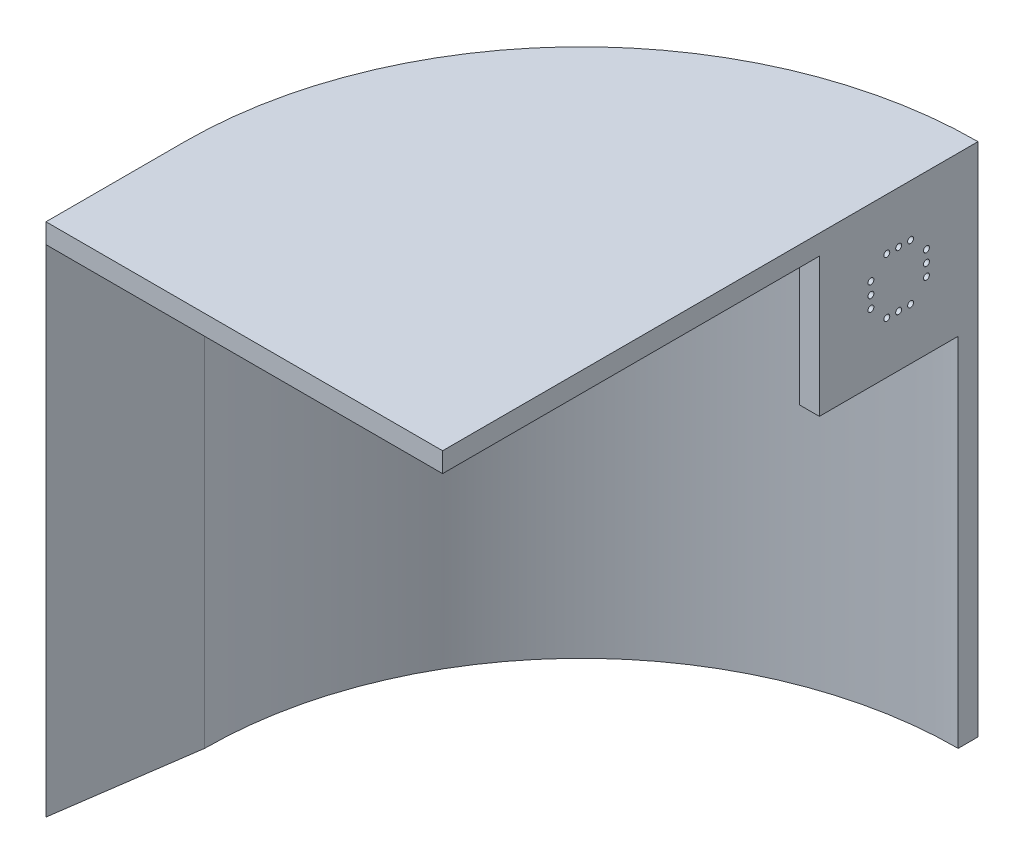
ISO-10303-21;
HEADER;
FILE_DESCRIPTION(('STEP AP214'),'2;1');
FILE_NAME('part.step','',(''),(''),'','','');
FILE_SCHEMA(('AUTOMOTIVE_DESIGN { 1 0 10303 214 1 1 1 1 }'));
ENDSEC;
DATA;
#1=APPLICATION_CONTEXT('core data for automotive mechanical design processes');
#2=APPLICATION_PROTOCOL_DEFINITION('international standard','automotive_design',2000,#1);
#3=PRODUCT_CONTEXT('',#1,'mechanical');
#4=PRODUCT('Part','Part','',(#3));
#5=PRODUCT_RELATED_PRODUCT_CATEGORY('part','',(#4));
#6=PRODUCT_DEFINITION_FORMATION('','',#4);
#7=PRODUCT_DEFINITION_CONTEXT('part definition',#1,'design');
#8=PRODUCT_DEFINITION('design','',#6,#7);
#9=PRODUCT_DEFINITION_SHAPE('','',#8);
#10=(LENGTH_UNIT() NAMED_UNIT(*) SI_UNIT(.MILLI.,.METRE.));
#11=(NAMED_UNIT(*) PLANE_ANGLE_UNIT() SI_UNIT($,.RADIAN.));
#12=(NAMED_UNIT(*) SI_UNIT($,.STERADIAN.) SOLID_ANGLE_UNIT());
#13=UNCERTAINTY_MEASURE_WITH_UNIT(LENGTH_MEASURE(1.E-05),#10,'distance_accuracy_value','');
#14=(GEOMETRIC_REPRESENTATION_CONTEXT(3) GLOBAL_UNCERTAINTY_ASSIGNED_CONTEXT((#13)) GLOBAL_UNIT_ASSIGNED_CONTEXT((#10,
#11,#12)) REPRESENTATION_CONTEXT('',''));
#15=CARTESIAN_POINT('',(0.,0.,0.));
#16=DIRECTION('',(0.,0.,1.));
#17=DIRECTION('',(1.,0.,0.));
#18=AXIS2_PLACEMENT_3D('',#15,#16,#17);
#19=CARTESIAN_POINT('',(0.,130.,35.));
#20=DIRECTION('',(0.,0.,-1.));
#21=DIRECTION('',(1.,0.,0.));
#22=AXIS2_PLACEMENT_3D('',#19,#20,#21);
#23=PLANE('',#22);
#24=DIRECTION('',(1.,0.,0.));
#25=VECTOR('',#24,1.);
#26=CARTESIAN_POINT('',(0.,125.,35.));
#27=LINE('',#26,#25);
#28=CARTESIAN_POINT('',(-100.,125.,35.));
#29=VERTEX_POINT('',#28);
#30=CARTESIAN_POINT('',(0.,125.,35.));
#31=VERTEX_POINT('',#30);
#32=EDGE_CURVE('E139',#29,#31,#27,.T.);
#33=ORIENTED_EDGE('',*,*,#32,.T.);
#34=DIRECTION('',(0.,-1.,0.));
#35=VECTOR('',#34,1.);
#36=CARTESIAN_POINT('',(0.,130.,35.));
#37=LINE('',#36,#35);
#38=CARTESIAN_POINT('',(0.,130.,35.));
#39=VERTEX_POINT('',#38);
#40=EDGE_CURVE('E180',#39,#31,#37,.T.);
#41=ORIENTED_EDGE('',*,*,#40,.F.);
#42=DIRECTION('',(-1.,0.,0.));
#43=VECTOR('',#42,1.);
#44=CARTESIAN_POINT('',(0.,130.,35.));
#45=LINE('',#44,#43);
#46=CARTESIAN_POINT('',(-100.,130.,35.));
#47=VERTEX_POINT('',#46);
#48=EDGE_CURVE('E163',#39,#47,#45,.T.);
#49=ORIENTED_EDGE('',*,*,#48,.T.);
#50=DIRECTION('',(0.,-1.,0.));
#51=VECTOR('',#50,1.);
#52=CARTESIAN_POINT('',(-100.,130.,35.));
#53=LINE('',#52,#51);
#54=EDGE_CURVE('E177',#47,#29,#53,.T.);
#55=ORIENTED_EDGE('',*,*,#54,.T.);
#56=EDGE_LOOP('',(#33,#41,#49,#55));
#57=FACE_BOUND('',#56,.T.);
#58=ADVANCED_FACE('F37',(#57),#23,.F.);
#59=CARTESIAN_POINT('',(0.,130.,0.));
#60=DIRECTION('',(0.,-1.,0.));
#61=DIRECTION('',(0.,0.,1.));
#62=AXIS2_PLACEMENT_3D('',#59,#60,#61);
#63=CYLINDRICAL_SURFACE('',#62,100.);
#64=CARTESIAN_POINT('',(0.,0.,0.));
#65=DIRECTION('',(0.,-1.,0.));
#66=DIRECTION('',(0.,0.,-1.));
#67=AXIS2_PLACEMENT_3D('',#64,#65,#66);
#68=CIRCLE('',#67,100.);
#69=CARTESIAN_POINT('',(-100.,0.,0.));
#70=VERTEX_POINT('',#69);
#71=CARTESIAN_POINT('',(0.,0.,-100.));
#72=VERTEX_POINT('',#71);
#73=EDGE_CURVE('E152',#70,#72,#68,.T.);
#74=ORIENTED_EDGE('',*,*,#73,.F.);
#75=DIRECTION('',(0.,-1.,0.));
#76=VECTOR('',#75,1.);
#77=CARTESIAN_POINT('',(-100.,130.,0.));
#78=LINE('',#77,#76);
#79=CARTESIAN_POINT('',(-100.,130.,0.));
#80=VERTEX_POINT('',#79);
#81=EDGE_CURVE('E168',#80,#70,#78,.T.);
#82=ORIENTED_EDGE('',*,*,#81,.F.);
#83=CARTESIAN_POINT('',(0.,130.,0.));
#84=DIRECTION('',(0.,-1.,0.));
#85=DIRECTION('',(0.,0.,-1.));
#86=AXIS2_PLACEMENT_3D('',#83,#84,#85);
#87=CIRCLE('',#86,100.);
#88=CARTESIAN_POINT('',(0.,130.,-100.));
#89=VERTEX_POINT('',#88);
#90=EDGE_CURVE('E157',#80,#89,#87,.T.);
#91=ORIENTED_EDGE('',*,*,#90,.T.);
#92=DIRECTION('',(0.,-1.,0.));
#93=VECTOR('',#92,1.);
#94=CARTESIAN_POINT('',(0.,130.,-100.));
#95=LINE('',#94,#93);
#96=EDGE_CURVE('E45',#89,#72,#95,.T.);
#97=ORIENTED_EDGE('',*,*,#96,.T.);
#98=EDGE_LOOP('',(#74,#82,#91,#97));
#99=FACE_BOUND('',#98,.T.);
#100=ADVANCED_FACE('F39',(#99),#63,.T.);
#101=CARTESIAN_POINT('',(0.,130.,-100.));
#102=DIRECTION('',(-1.,0.,0.));
#103=DIRECTION('',(0.,0.,-1.));
#104=AXIS2_PLACEMENT_3D('',#101,#102,#103);
#105=PLANE('',#104);
#106=CARTESIAN_POINT('',(0.,103.,-82.9999999999995));
#107=DIRECTION('',(-1.,0.,0.));
#108=DIRECTION('',(0.,0.,1.));
#109=AXIS2_PLACEMENT_3D('',#106,#107,#108);
#110=CIRCLE('',#109,0.749999999999995);
#111=CARTESIAN_POINT('',(0.,103.,-82.2499999999995));
#112=VERTEX_POINT('',#111);
#113=EDGE_CURVE('E221',#112,#112,#110,.T.);
#114=ORIENTED_EDGE('',*,*,#113,.T.);
#115=EDGE_LOOP('',(#114));
#116=FACE_BOUND('',#115,.T.);
#117=CARTESIAN_POINT('',(0.,103.,-76.9999999999995));
#118=DIRECTION('',(-1.,0.,0.));
#119=DIRECTION('',(0.,0.,1.));
#120=AXIS2_PLACEMENT_3D('',#117,#118,#119);
#121=CIRCLE('',#120,0.749999999999995);
#122=CARTESIAN_POINT('',(0.,103.,-76.2499999999995));
#123=VERTEX_POINT('',#122);
#124=EDGE_CURVE('E220',#123,#123,#121,.T.);
#125=ORIENTED_EDGE('',*,*,#124,.T.);
#126=EDGE_LOOP('',(#125));
#127=FACE_BOUND('',#126,.T.);
#128=CARTESIAN_POINT('',(0.,103.,-79.9999999999995));
#129=DIRECTION('',(-1.,0.,0.));
#130=DIRECTION('',(0.,0.,1.));
#131=AXIS2_PLACEMENT_3D('',#128,#129,#130);
#132=CIRCLE('',#131,0.749999999999995);
#133=CARTESIAN_POINT('',(0.,103.,-79.2499999999995));
#134=VERTEX_POINT('',#133);
#135=EDGE_CURVE('E227',#134,#134,#132,.T.);
#136=ORIENTED_EDGE('',*,*,#135,.T.);
#137=EDGE_LOOP('',(#136));
#138=FACE_BOUND('',#137,.T.);
#139=CARTESIAN_POINT('',(0.,117.000000000001,-77.0000000000002));
#140=DIRECTION('',(-1.,0.,0.));
#141=DIRECTION('',(0.,0.,1.));
#142=AXIS2_PLACEMENT_3D('',#139,#140,#141);
#143=CIRCLE('',#142,0.749999999999999);
#144=CARTESIAN_POINT('',(0.,117.000000000001,-76.2500000000002));
#145=VERTEX_POINT('',#144);
#146=EDGE_CURVE('E239',#145,#145,#143,.T.);
#147=ORIENTED_EDGE('',*,*,#146,.T.);
#148=EDGE_LOOP('',(#147));
#149=FACE_BOUND('',#148,.T.);
#150=CARTESIAN_POINT('',(0.,110.000000000001,-72.9999999999997));
#151=DIRECTION('',(-1.,0.,0.));
#152=DIRECTION('',(0.,0.,1.));
#153=AXIS2_PLACEMENT_3D('',#150,#151,#152);
#154=CIRCLE('',#153,0.749999999999995);
#155=CARTESIAN_POINT('',(0.,110.000000000001,-72.2499999999997));
#156=VERTEX_POINT('',#155);
#157=EDGE_CURVE('E240',#156,#156,#154,.T.);
#158=ORIENTED_EDGE('',*,*,#157,.T.);
#159=EDGE_LOOP('',(#158));
#160=FACE_BOUND('',#159,.T.);
#161=CARTESIAN_POINT('',(0.,113.000000000001,-72.9999999999997));
#162=DIRECTION('',(-1.,0.,0.));
#163=DIRECTION('',(0.,0.,1.));
#164=AXIS2_PLACEMENT_3D('',#161,#162,#163);
#165=CIRCLE('',#164,0.749999999999995);
#166=CARTESIAN_POINT('',(0.,113.000000000001,-72.2499999999997));
#167=VERTEX_POINT('',#166);
#168=EDGE_CURVE('E253',#167,#167,#165,.T.);
#169=ORIENTED_EDGE('',*,*,#168,.T.);
#170=EDGE_LOOP('',(#169));
#171=FACE_BOUND('',#170,.T.);
#172=CARTESIAN_POINT('',(0.,107.000000000001,-72.9999999999997));
#173=DIRECTION('',(-1.,0.,0.));
#174=DIRECTION('',(0.,0.,1.));
#175=AXIS2_PLACEMENT_3D('',#172,#173,#174);
#176=CIRCLE('',#175,0.749999999999995);
#177=CARTESIAN_POINT('',(0.,107.000000000001,-72.2499999999997));
#178=VERTEX_POINT('',#177);
#179=EDGE_CURVE('E233',#178,#178,#176,.T.);
#180=ORIENTED_EDGE('',*,*,#179,.T.);
#181=EDGE_LOOP('',(#180));
#182=FACE_BOUND('',#181,.T.);
#183=CARTESIAN_POINT('',(0.,117.000000000001,-83.0000000000002));
#184=DIRECTION('',(-1.,0.,0.));
#185=DIRECTION('',(0.,0.,1.));
#186=AXIS2_PLACEMENT_3D('',#183,#184,#185);
#187=CIRCLE('',#186,0.749999999999999);
#188=CARTESIAN_POINT('',(0.,117.000000000001,-82.2500000000002));
#189=VERTEX_POINT('',#188);
#190=EDGE_CURVE('E247',#189,#189,#187,.T.);
#191=ORIENTED_EDGE('',*,*,#190,.T.);
#192=EDGE_LOOP('',(#191));
#193=FACE_BOUND('',#192,.T.);
#194=CARTESIAN_POINT('',(0.,117.000000000001,-80.0000000000002));
#195=DIRECTION('',(-1.,0.,0.));
#196=DIRECTION('',(0.,0.,1.));
#197=AXIS2_PLACEMENT_3D('',#194,#195,#196);
#198=CIRCLE('',#197,0.749999999999999);
#199=CARTESIAN_POINT('',(0.,117.000000000001,-79.2500000000002));
#200=VERTEX_POINT('',#199);
#201=EDGE_CURVE('E263',#200,#200,#198,.T.);
#202=ORIENTED_EDGE('',*,*,#201,.T.);
#203=EDGE_LOOP('',(#202));
#204=FACE_BOUND('',#203,.T.);
#205=CARTESIAN_POINT('',(0.,113.,-87.));
#206=DIRECTION('',(-1.,0.,0.));
#207=DIRECTION('',(0.,0.,1.));
#208=AXIS2_PLACEMENT_3D('',#205,#206,#207);
#209=CIRCLE('',#208,0.749999999999999);
#210=CARTESIAN_POINT('',(0.,113.,-86.25));
#211=VERTEX_POINT('',#210);
#212=EDGE_CURVE('E269',#211,#211,#209,.T.);
#213=ORIENTED_EDGE('',*,*,#212,.T.);
#214=EDGE_LOOP('',(#213));
#215=FACE_BOUND('',#214,.T.);
#216=CARTESIAN_POINT('',(0.,107.,-87.));
#217=DIRECTION('',(-1.,0.,0.));
#218=DIRECTION('',(0.,0.,1.));
#219=AXIS2_PLACEMENT_3D('',#216,#217,#218);
#220=CIRCLE('',#219,0.749999999999999);
#221=CARTESIAN_POINT('',(0.,107.,-86.25));
#222=VERTEX_POINT('',#221);
#223=EDGE_CURVE('E275',#222,#222,#220,.T.);
#224=ORIENTED_EDGE('',*,*,#223,.T.);
#225=EDGE_LOOP('',(#224));
#226=FACE_BOUND('',#225,.T.);
#227=CARTESIAN_POINT('',(0.,110.,-87.));
#228=DIRECTION('',(-1.,0.,0.));
#229=DIRECTION('',(0.,0.,1.));
#230=AXIS2_PLACEMENT_3D('',#227,#228,#229);
#231=CIRCLE('',#230,0.749999999999999);
#232=CARTESIAN_POINT('',(0.,110.,-86.25));
#233=VERTEX_POINT('',#232);
#234=EDGE_CURVE('E213',#233,#233,#231,.T.);
#235=ORIENTED_EDGE('',*,*,#234,.T.);
#236=EDGE_LOOP('',(#235));
#237=FACE_BOUND('',#236,.T.);
#238=DIRECTION('',(0.,-1.,0.));
#239=VECTOR('',#238,1.);
#240=CARTESIAN_POINT('',(0.,125.,-95.));
#241=LINE('',#240,#239);
#242=CARTESIAN_POINT('',(0.,90.,-95.));
#243=VERTEX_POINT('',#242);
#244=CARTESIAN_POINT('',(0.,0.,-95.));
#245=VERTEX_POINT('',#244);
#246=EDGE_CURVE('E149',#243,#245,#241,.T.);
#247=ORIENTED_EDGE('',*,*,#246,.T.);
#248=DIRECTION('',(0.,0.,1.));
#249=VECTOR('',#248,1.);
#250=CARTESIAN_POINT('',(0.,0.,-100.));
#251=LINE('',#250,#249);
#252=EDGE_CURVE('E171',#72,#245,#251,.T.);
#253=ORIENTED_EDGE('',*,*,#252,.F.);
#254=ORIENTED_EDGE('',*,*,#96,.F.);
#255=DIRECTION('',(0.,0.,1.));
#256=VECTOR('',#255,1.);
#257=CARTESIAN_POINT('',(0.,130.,-100.));
#258=LINE('',#257,#256);
#259=EDGE_CURVE('E160',#89,#39,#258,.T.);
#260=ORIENTED_EDGE('',*,*,#259,.T.);
#261=ORIENTED_EDGE('',*,*,#40,.T.);
#262=DIRECTION('',(0.,0.,-1.));
#263=VECTOR('',#262,1.);
#264=CARTESIAN_POINT('',(0.,125.,-95.));
#265=LINE('',#264,#263);
#266=CARTESIAN_POINT('',(0.,125.,-60.));
#267=VERTEX_POINT('',#266);
#268=EDGE_CURVE('E142',#31,#267,#265,.T.);
#269=ORIENTED_EDGE('',*,*,#268,.T.);
#270=DIRECTION('',(0.,1.,0.));
#271=VECTOR('',#270,1.);
#272=CARTESIAN_POINT('',(0.,125.,-60.));
#273=LINE('',#272,#271);
#274=CARTESIAN_POINT('',(0.,90.,-60.));
#275=VERTEX_POINT('',#274);
#276=EDGE_CURVE('E121',#275,#267,#273,.T.);
#277=ORIENTED_EDGE('',*,*,#276,.F.);
#278=DIRECTION('',(0.,0.,1.));
#279=VECTOR('',#278,1.);
#280=CARTESIAN_POINT('',(0.,90.,-95.));
#281=LINE('',#280,#279);
#282=EDGE_CURVE('E124',#243,#275,#281,.T.);
#283=ORIENTED_EDGE('',*,*,#282,.F.);
#284=EDGE_LOOP('',(#247,#253,#254,#260,#261,#269,#277,#283));
#285=FACE_BOUND('',#284,.T.);
#286=ADVANCED_FACE('F201',(#116,#127,#138,#149,#160,#171,#182,#193,#204,#215,#226,#237,#285),
#105,.F.);
#287=CARTESIAN_POINT('',(-100.,130.,35.));
#288=DIRECTION('',(1.,0.,0.));
#289=DIRECTION('',(0.,0.,1.));
#290=AXIS2_PLACEMENT_3D('',#287,#288,#289);
#291=PLANE('',#290);
#292=DIRECTION('',(0.,0.,-1.));
#293=VECTOR('',#292,1.);
#294=CARTESIAN_POINT('',(-100.,0.,35.));
#295=LINE('',#294,#293);
#296=CARTESIAN_POINT('',(-100.,0.,35.));
#297=VERTEX_POINT('',#296);
#298=EDGE_CURVE('E161',#297,#70,#295,.T.);
#299=ORIENTED_EDGE('',*,*,#298,.F.);
#300=DIRECTION('',(0.,-1.,0.));
#301=VECTOR('',#300,1.);
#302=CARTESIAN_POINT('',(-100.,125.,35.));
#303=LINE('',#302,#301);
#304=EDGE_CURVE('E153',#29,#297,#303,.T.);
#305=ORIENTED_EDGE('',*,*,#304,.F.);
#306=ORIENTED_EDGE('',*,*,#54,.F.);
#307=DIRECTION('',(0.,0.,-1.));
#308=VECTOR('',#307,1.);
#309=CARTESIAN_POINT('',(-100.,130.,35.));
#310=LINE('',#309,#308);
#311=EDGE_CURVE('E166',#47,#80,#310,.T.);
#312=ORIENTED_EDGE('',*,*,#311,.T.);
#313=ORIENTED_EDGE('',*,*,#81,.T.);
#314=EDGE_LOOP('',(#299,#305,#306,#312,#313));
#315=FACE_BOUND('',#314,.T.);
#316=ADVANCED_FACE('F195',(#315),#291,.F.);
#317=CARTESIAN_POINT('',(0.,130.,0.));
#318=DIRECTION('',(0.,1.,0.));
#319=DIRECTION('',(0.,0.,-1.));
#320=AXIS2_PLACEMENT_3D('',#317,#318,#319);
#321=PLANE('',#320);
#322=ORIENTED_EDGE('',*,*,#90,.F.);
#323=ORIENTED_EDGE('',*,*,#311,.F.);
#324=ORIENTED_EDGE('',*,*,#48,.F.);
#325=ORIENTED_EDGE('',*,*,#259,.F.);
#326=EDGE_LOOP('',(#322,#323,#324,#325));
#327=FACE_BOUND('',#326,.T.);
#328=ADVANCED_FACE('F199',(#327),#321,.T.);
#329=CARTESIAN_POINT('',(0.,0.,0.));
#330=DIRECTION('',(0.,1.,0.));
#331=DIRECTION('',(0.,0.,-1.));
#332=AXIS2_PLACEMENT_3D('',#329,#330,#331);
#333=PLANE('',#332);
#334=DIRECTION('',(-0.14142135623731,0.,0.989949493661166));
#335=VECTOR('',#334,1.);
#336=CARTESIAN_POINT('',(-100.,0.,35.));
#337=LINE('',#336,#335);
#338=CARTESIAN_POINT('',(-95.,0.,0.));
#339=VERTEX_POINT('',#338);
#340=EDGE_CURVE('E137',#339,#297,#337,.T.);
#341=ORIENTED_EDGE('',*,*,#340,.T.);
#342=ORIENTED_EDGE('',*,*,#298,.T.);
#343=ORIENTED_EDGE('',*,*,#73,.T.);
#344=ORIENTED_EDGE('',*,*,#252,.T.);
#345=CARTESIAN_POINT('',(0.,0.,0.));
#346=DIRECTION('',(0.,1.,0.));
#347=DIRECTION('',(0.,0.,1.));
#348=AXIS2_PLACEMENT_3D('',#345,#346,#347);
#349=CIRCLE('',#348,95.);
#350=EDGE_CURVE('E132',#245,#339,#349,.T.);
#351=ORIENTED_EDGE('',*,*,#350,.T.);
#352=EDGE_LOOP('',(#341,#342,#343,#344,#351));
#353=FACE_BOUND('',#352,.T.);
#354=ADVANCED_FACE('F190',(#353),#333,.F.);
#355=CARTESIAN_POINT('',(0.,125.,0.));
#356=DIRECTION('',(0.,-1.,0.));
#357=DIRECTION('',(0.,0.,1.));
#358=AXIS2_PLACEMENT_3D('',#355,#356,#357);
#359=CYLINDRICAL_SURFACE('',#358,95.);
#360=DIRECTION('',(0.,-1.,0.));
#361=VECTOR('',#360,1.);
#362=CARTESIAN_POINT('',(-5.,125.,-94.8683298050514));
#363=LINE('',#362,#361);
#364=CARTESIAN_POINT('',(-5.,90.,-94.8683298050514));
#365=VERTEX_POINT('',#364);
#366=CARTESIAN_POINT('',(-5.,125.,-94.8683298050514));
#367=VERTEX_POINT('',#366);
#368=EDGE_CURVE('E120',#365,#367,#363,.F.);
#369=ORIENTED_EDGE('',*,*,#368,.T.);
#370=CARTESIAN_POINT('',(0.,125.,0.));
#371=DIRECTION('',(0.,1.,0.));
#372=DIRECTION('',(0.,0.,1.));
#373=AXIS2_PLACEMENT_3D('',#370,#371,#372);
#374=CIRCLE('',#373,95.);
#375=CARTESIAN_POINT('',(-95.,125.,0.));
#376=VERTEX_POINT('',#375);
#377=EDGE_CURVE('E133',#367,#376,#374,.T.);
#378=ORIENTED_EDGE('',*,*,#377,.T.);
#379=DIRECTION('',(0.,-1.,0.));
#380=VECTOR('',#379,1.);
#381=CARTESIAN_POINT('',(-95.,125.,0.));
#382=LINE('',#381,#380);
#383=EDGE_CURVE('E145',#376,#339,#382,.T.);
#384=ORIENTED_EDGE('',*,*,#383,.T.);
#385=ORIENTED_EDGE('',*,*,#350,.F.);
#386=ORIENTED_EDGE('',*,*,#246,.F.);
#387=CARTESIAN_POINT('',(0.,90.,0.));
#388=DIRECTION('',(0.,1.,0.));
#389=DIRECTION('',(0.,0.,1.));
#390=AXIS2_PLACEMENT_3D('',#387,#388,#389);
#391=CIRCLE('',#390,95.);
#392=EDGE_CURVE('E11',#365,#243,#391,.F.);
#393=ORIENTED_EDGE('',*,*,#392,.F.);
#394=EDGE_LOOP('',(#369,#378,#384,#385,#386,#393));
#395=FACE_BOUND('',#394,.T.);
#396=ADVANCED_FACE('F385',(#395),#359,.F.);
#397=CARTESIAN_POINT('',(-100.,125.,35.));
#398=DIRECTION('',(-0.989949493661167,0.,-0.14142135623731));
#399=DIRECTION('',(0.14142135623731,0.,-0.989949493661166));
#400=AXIS2_PLACEMENT_3D('',#397,#398,#399);
#401=PLANE('',#400);
#402=ORIENTED_EDGE('',*,*,#340,.F.);
#403=ORIENTED_EDGE('',*,*,#383,.F.);
#404=DIRECTION('',(-0.14142135623731,0.,0.989949493661166));
#405=VECTOR('',#404,1.);
#406=CARTESIAN_POINT('',(-100.,125.,35.));
#407=LINE('',#406,#405);
#408=EDGE_CURVE('E136',#376,#29,#407,.T.);
#409=ORIENTED_EDGE('',*,*,#408,.T.);
#410=ORIENTED_EDGE('',*,*,#304,.T.);
#411=EDGE_LOOP('',(#402,#403,#409,#410));
#412=FACE_BOUND('',#411,.T.);
#413=ADVANCED_FACE('F382',(#412),#401,.F.);
#414=CARTESIAN_POINT('',(0.,125.,0.));
#415=DIRECTION('',(0.,-1.,0.));
#416=DIRECTION('',(0.,0.,1.));
#417=AXIS2_PLACEMENT_3D('',#414,#415,#416);
#418=PLANE('',#417);
#419=DIRECTION('',(1.,0.,0.));
#420=VECTOR('',#419,1.);
#421=CARTESIAN_POINT('',(-5.,125.,-60.));
#422=LINE('',#421,#420);
#423=CARTESIAN_POINT('',(-5.,125.,-60.));
#424=VERTEX_POINT('',#423);
#425=EDGE_CURVE('E112',#424,#267,#422,.T.);
#426=ORIENTED_EDGE('',*,*,#425,.T.);
#427=ORIENTED_EDGE('',*,*,#268,.F.);
#428=ORIENTED_EDGE('',*,*,#32,.F.);
#429=ORIENTED_EDGE('',*,*,#408,.F.);
#430=ORIENTED_EDGE('',*,*,#377,.F.);
#431=DIRECTION('',(0.,0.,-1.));
#432=VECTOR('',#431,1.);
#433=CARTESIAN_POINT('',(-5.,125.,-95.));
#434=LINE('',#433,#432);
#435=EDGE_CURVE('E115',#424,#367,#434,.T.);
#436=ORIENTED_EDGE('',*,*,#435,.F.);
#437=EDGE_LOOP('',(#426,#427,#428,#429,#430,#436));
#438=FACE_BOUND('',#437,.T.);
#439=ADVANCED_FACE('F205',(#438),#418,.T.);
#440=CARTESIAN_POINT('',(-5.,90.,-95.));
#441=DIRECTION('',(0.,-1.,0.));
#442=DIRECTION('',(0.,0.,1.));
#443=AXIS2_PLACEMENT_3D('',#440,#441,#442);
#444=PLANE('',#443);
#445=ORIENTED_EDGE('',*,*,#392,.T.);
#446=ORIENTED_EDGE('',*,*,#282,.T.);
#447=DIRECTION('',(1.,0.,0.));
#448=VECTOR('',#447,1.);
#449=CARTESIAN_POINT('',(-5.,90.,-60.));
#450=LINE('',#449,#448);
#451=CARTESIAN_POINT('',(-5.,90.,-60.));
#452=VERTEX_POINT('',#451);
#453=EDGE_CURVE('E111',#452,#275,#450,.T.);
#454=ORIENTED_EDGE('',*,*,#453,.F.);
#455=DIRECTION('',(0.,0.,1.));
#456=VECTOR('',#455,1.);
#457=CARTESIAN_POINT('',(-5.,90.,-95.));
#458=LINE('',#457,#456);
#459=EDGE_CURVE('E51',#365,#452,#458,.T.);
#460=ORIENTED_EDGE('',*,*,#459,.F.);
#461=EDGE_LOOP('',(#445,#446,#454,#460));
#462=FACE_BOUND('',#461,.T.);
#463=ADVANCED_FACE('F123',(#462),#444,.T.);
#464=CARTESIAN_POINT('',(-5.,0.,0.));
#465=DIRECTION('',(1.,0.,0.));
#466=DIRECTION('',(0.,0.,1.));
#467=AXIS2_PLACEMENT_3D('',#464,#465,#466);
#468=PLANE('',#467);
#469=CARTESIAN_POINT('',(-5.,103.,-82.9999999999995));
#470=DIRECTION('',(-1.,0.,0.));
#471=DIRECTION('',(0.,0.,1.));
#472=AXIS2_PLACEMENT_3D('',#469,#470,#471);
#473=CIRCLE('',#472,0.749999999999995);
#474=CARTESIAN_POINT('',(-5.,103.,-82.2499999999995));
#475=VERTEX_POINT('',#474);
#476=EDGE_CURVE('E217',#475,#475,#473,.F.);
#477=ORIENTED_EDGE('',*,*,#476,.T.);
#478=EDGE_LOOP('',(#477));
#479=FACE_BOUND('',#478,.T.);
#480=CARTESIAN_POINT('',(-5.,103.,-76.9999999999995));
#481=DIRECTION('',(-1.,0.,0.));
#482=DIRECTION('',(0.,0.,1.));
#483=AXIS2_PLACEMENT_3D('',#480,#481,#482);
#484=CIRCLE('',#483,0.749999999999995);
#485=CARTESIAN_POINT('',(-5.,103.,-76.2499999999995));
#486=VERTEX_POINT('',#485);
#487=EDGE_CURVE('E224',#486,#486,#484,.F.);
#488=ORIENTED_EDGE('',*,*,#487,.T.);
#489=EDGE_LOOP('',(#488));
#490=FACE_BOUND('',#489,.T.);
#491=CARTESIAN_POINT('',(-5.,103.,-79.9999999999995));
#492=DIRECTION('',(-1.,0.,0.));
#493=DIRECTION('',(0.,0.,1.));
#494=AXIS2_PLACEMENT_3D('',#491,#492,#493);
#495=CIRCLE('',#494,0.749999999999995);
#496=CARTESIAN_POINT('',(-5.,103.,-79.2499999999995));
#497=VERTEX_POINT('',#496);
#498=EDGE_CURVE('E230',#497,#497,#495,.F.);
#499=ORIENTED_EDGE('',*,*,#498,.T.);
#500=EDGE_LOOP('',(#499));
#501=FACE_BOUND('',#500,.T.);
#502=CARTESIAN_POINT('',(-5.,117.000000000001,-77.0000000000002));
#503=DIRECTION('',(-1.,0.,0.));
#504=DIRECTION('',(0.,0.,1.));
#505=AXIS2_PLACEMENT_3D('',#502,#503,#504);
#506=CIRCLE('',#505,0.749999999999999);
#507=CARTESIAN_POINT('',(-5.,117.000000000001,-76.2500000000002));
#508=VERTEX_POINT('',#507);
#509=EDGE_CURVE('E244',#508,#508,#506,.F.);
#510=ORIENTED_EDGE('',*,*,#509,.T.);
#511=EDGE_LOOP('',(#510));
#512=FACE_BOUND('',#511,.T.);
#513=CARTESIAN_POINT('',(-5.,110.000000000001,-72.9999999999997));
#514=DIRECTION('',(-1.,0.,0.));
#515=DIRECTION('',(0.,0.,1.));
#516=AXIS2_PLACEMENT_3D('',#513,#514,#515);
#517=CIRCLE('',#516,0.749999999999995);
#518=CARTESIAN_POINT('',(-5.,110.000000000001,-72.2499999999997));
#519=VERTEX_POINT('',#518);
#520=EDGE_CURVE('E236',#519,#519,#517,.F.);
#521=ORIENTED_EDGE('',*,*,#520,.T.);
#522=EDGE_LOOP('',(#521));
#523=FACE_BOUND('',#522,.T.);
#524=CARTESIAN_POINT('',(-5.,113.000000000001,-72.9999999999997));
#525=DIRECTION('',(-1.,0.,0.));
#526=DIRECTION('',(0.,0.,1.));
#527=AXIS2_PLACEMENT_3D('',#524,#525,#526);
#528=CIRCLE('',#527,0.749999999999995);
#529=CARTESIAN_POINT('',(-5.,113.000000000001,-72.2499999999997));
#530=VERTEX_POINT('',#529);
#531=EDGE_CURVE('E243',#530,#530,#528,.F.);
#532=ORIENTED_EDGE('',*,*,#531,.T.);
#533=EDGE_LOOP('',(#532));
#534=FACE_BOUND('',#533,.T.);
#535=CARTESIAN_POINT('',(-5.,107.000000000001,-72.9999999999997));
#536=DIRECTION('',(-1.,0.,0.));
#537=DIRECTION('',(0.,0.,1.));
#538=AXIS2_PLACEMENT_3D('',#535,#536,#537);
#539=CIRCLE('',#538,0.749999999999995);
#540=CARTESIAN_POINT('',(-5.,107.000000000001,-72.2499999999997));
#541=VERTEX_POINT('',#540);
#542=EDGE_CURVE('E250',#541,#541,#539,.F.);
#543=ORIENTED_EDGE('',*,*,#542,.T.);
#544=EDGE_LOOP('',(#543));
#545=FACE_BOUND('',#544,.T.);
#546=CARTESIAN_POINT('',(-5.,117.000000000001,-83.0000000000002));
#547=DIRECTION('',(-1.,0.,0.));
#548=DIRECTION('',(0.,0.,1.));
#549=AXIS2_PLACEMENT_3D('',#546,#547,#548);
#550=CIRCLE('',#549,0.749999999999999);
#551=CARTESIAN_POINT('',(-5.,117.000000000001,-82.2500000000002));
#552=VERTEX_POINT('',#551);
#553=EDGE_CURVE('E260',#552,#552,#550,.F.);
#554=ORIENTED_EDGE('',*,*,#553,.T.);
#555=EDGE_LOOP('',(#554));
#556=FACE_BOUND('',#555,.T.);
#557=CARTESIAN_POINT('',(-5.,117.000000000001,-80.0000000000002));
#558=DIRECTION('',(-1.,0.,0.));
#559=DIRECTION('',(0.,0.,1.));
#560=AXIS2_PLACEMENT_3D('',#557,#558,#559);
#561=CIRCLE('',#560,0.749999999999999);
#562=CARTESIAN_POINT('',(-5.,117.000000000001,-79.2500000000002));
#563=VERTEX_POINT('',#562);
#564=EDGE_CURVE('E266',#563,#563,#561,.F.);
#565=ORIENTED_EDGE('',*,*,#564,.T.);
#566=EDGE_LOOP('',(#565));
#567=FACE_BOUND('',#566,.T.);
#568=CARTESIAN_POINT('',(-5.,113.,-87.));
#569=DIRECTION('',(-1.,0.,0.));
#570=DIRECTION('',(0.,0.,1.));
#571=AXIS2_PLACEMENT_3D('',#568,#569,#570);
#572=CIRCLE('',#571,0.749999999999999);
#573=CARTESIAN_POINT('',(-5.,113.,-86.25));
#574=VERTEX_POINT('',#573);
#575=EDGE_CURVE('E272',#574,#574,#572,.F.);
#576=ORIENTED_EDGE('',*,*,#575,.T.);
#577=EDGE_LOOP('',(#576));
#578=FACE_BOUND('',#577,.T.);
#579=CARTESIAN_POINT('',(-5.,107.,-87.));
#580=DIRECTION('',(-1.,0.,0.));
#581=DIRECTION('',(0.,0.,1.));
#582=AXIS2_PLACEMENT_3D('',#579,#580,#581);
#583=CIRCLE('',#582,0.749999999999999);
#584=CARTESIAN_POINT('',(-5.,107.,-86.25));
#585=VERTEX_POINT('',#584);
#586=EDGE_CURVE('E216',#585,#585,#583,.F.);
#587=ORIENTED_EDGE('',*,*,#586,.T.);
#588=EDGE_LOOP('',(#587));
#589=FACE_BOUND('',#588,.T.);
#590=CARTESIAN_POINT('',(-5.,110.,-87.));
#591=DIRECTION('',(-1.,0.,0.));
#592=DIRECTION('',(0.,0.,1.));
#593=AXIS2_PLACEMENT_3D('',#590,#591,#592);
#594=CIRCLE('',#593,0.749999999999999);
#595=CARTESIAN_POINT('',(-5.,110.,-86.25));
#596=VERTEX_POINT('',#595);
#597=EDGE_CURVE('E208',#596,#596,#594,.F.);
#598=ORIENTED_EDGE('',*,*,#597,.T.);
#599=EDGE_LOOP('',(#598));
#600=FACE_BOUND('',#599,.T.);
#601=ORIENTED_EDGE('',*,*,#459,.T.);
#602=DIRECTION('',(0.,1.,0.));
#603=VECTOR('',#602,1.);
#604=CARTESIAN_POINT('',(-5.,125.,-60.));
#605=LINE('',#604,#603);
#606=EDGE_CURVE('E108',#452,#424,#605,.T.);
#607=ORIENTED_EDGE('',*,*,#606,.T.);
#608=ORIENTED_EDGE('',*,*,#435,.T.);
#609=ORIENTED_EDGE('',*,*,#368,.F.);
#610=EDGE_LOOP('',(#601,#607,#608,#609));
#611=FACE_BOUND('',#610,.T.);
#612=ADVANCED_FACE('F118',(#479,#490,#501,#512,#523,#534,#545,#556,#567,#578,#589,#600,#611),
#468,.F.);
#613=CARTESIAN_POINT('',(-5.,125.,-60.));
#614=DIRECTION('',(0.,0.,1.));
#615=DIRECTION('',(-1.,0.,0.));
#616=AXIS2_PLACEMENT_3D('',#613,#614,#615);
#617=PLANE('',#616);
#618=ORIENTED_EDGE('',*,*,#276,.T.);
#619=ORIENTED_EDGE('',*,*,#425,.F.);
#620=ORIENTED_EDGE('',*,*,#606,.F.);
#621=ORIENTED_EDGE('',*,*,#453,.T.);
#622=EDGE_LOOP('',(#618,#619,#620,#621));
#623=FACE_BOUND('',#622,.T.);
#624=ADVANCED_FACE('F110',(#623),#617,.T.);
#625=CARTESIAN_POINT('',(-7.12132034355964,110.,-87.));
#626=DIRECTION('',(1.,0.,0.));
#627=DIRECTION('',(0.,0.,1.));
#628=AXIS2_PLACEMENT_3D('',#625,#626,#627);
#629=CYLINDRICAL_SURFACE('',#628,0.749999999999999);
#630=ORIENTED_EDGE('',*,*,#597,.F.);
#631=EDGE_LOOP('',(#630));
#632=FACE_BOUND('',#631,.T.);
#633=ORIENTED_EDGE('',*,*,#234,.F.);
#634=EDGE_LOOP('',(#633));
#635=FACE_BOUND('',#634,.T.);
#636=ADVANCED_FACE('F288',(#632,#635),#629,.F.);
#637=CARTESIAN_POINT('',(-7.12132034355964,107.,-87.));
#638=DIRECTION('',(1.,0.,0.));
#639=DIRECTION('',(0.,0.,1.));
#640=AXIS2_PLACEMENT_3D('',#637,#638,#639);
#641=CYLINDRICAL_SURFACE('',#640,0.749999999999999);
#642=ORIENTED_EDGE('',*,*,#586,.F.);
#643=EDGE_LOOP('',(#642));
#644=FACE_BOUND('',#643,.T.);
#645=ORIENTED_EDGE('',*,*,#223,.F.);
#646=EDGE_LOOP('',(#645));
#647=FACE_BOUND('',#646,.T.);
#648=ADVANCED_FACE('F285',(#644,#647),#641,.F.);
#649=CARTESIAN_POINT('',(-7.12132034355964,113.,-87.));
#650=DIRECTION('',(1.,0.,0.));
#651=DIRECTION('',(0.,0.,1.));
#652=AXIS2_PLACEMENT_3D('',#649,#650,#651);
#653=CYLINDRICAL_SURFACE('',#652,0.749999999999999);
#654=ORIENTED_EDGE('',*,*,#575,.F.);
#655=EDGE_LOOP('',(#654));
#656=FACE_BOUND('',#655,.T.);
#657=ORIENTED_EDGE('',*,*,#212,.F.);
#658=EDGE_LOOP('',(#657));
#659=FACE_BOUND('',#658,.T.);
#660=ADVANCED_FACE('F287',(#656,#659),#653,.F.);
#661=CARTESIAN_POINT('',(-7.12132034355964,117.000000000001,-80.0000000000002));
#662=DIRECTION('',(1.,0.,0.));
#663=DIRECTION('',(0.,0.,1.));
#664=AXIS2_PLACEMENT_3D('',#661,#662,#663);
#665=CYLINDRICAL_SURFACE('',#664,0.749999999999999);
#666=ORIENTED_EDGE('',*,*,#564,.F.);
#667=EDGE_LOOP('',(#666));
#668=FACE_BOUND('',#667,.T.);
#669=ORIENTED_EDGE('',*,*,#201,.F.);
#670=EDGE_LOOP('',(#669));
#671=FACE_BOUND('',#670,.T.);
#672=ADVANCED_FACE('F295',(#668,#671),#665,.F.);
#673=CARTESIAN_POINT('',(-7.12132034355964,117.000000000001,-83.0000000000002));
#674=DIRECTION('',(1.,0.,0.));
#675=DIRECTION('',(0.,0.,1.));
#676=AXIS2_PLACEMENT_3D('',#673,#674,#675);
#677=CYLINDRICAL_SURFACE('',#676,0.749999999999999);
#678=ORIENTED_EDGE('',*,*,#553,.F.);
#679=EDGE_LOOP('',(#678));
#680=FACE_BOUND('',#679,.T.);
#681=ORIENTED_EDGE('',*,*,#190,.F.);
#682=EDGE_LOOP('',(#681));
#683=FACE_BOUND('',#682,.T.);
#684=ADVANCED_FACE('F335',(#680,#683),#677,.F.);
#685=CARTESIAN_POINT('',(-7.12132034355964,107.000000000001,-72.9999999999997));
#686=DIRECTION('',(1.,0.,0.));
#687=DIRECTION('',(0.,0.,1.));
#688=AXIS2_PLACEMENT_3D('',#685,#686,#687);
#689=CYLINDRICAL_SURFACE('',#688,0.749999999999995);
#690=ORIENTED_EDGE('',*,*,#542,.F.);
#691=EDGE_LOOP('',(#690));
#692=FACE_BOUND('',#691,.T.);
#693=ORIENTED_EDGE('',*,*,#179,.F.);
#694=EDGE_LOOP('',(#693));
#695=FACE_BOUND('',#694,.T.);
#696=ADVANCED_FACE('F341',(#692,#695),#689,.F.);
#697=CARTESIAN_POINT('',(-7.12132034355964,113.000000000001,-72.9999999999997));
#698=DIRECTION('',(1.,0.,0.));
#699=DIRECTION('',(0.,0.,1.));
#700=AXIS2_PLACEMENT_3D('',#697,#698,#699);
#701=CYLINDRICAL_SURFACE('',#700,0.749999999999995);
#702=ORIENTED_EDGE('',*,*,#531,.F.);
#703=EDGE_LOOP('',(#702));
#704=FACE_BOUND('',#703,.T.);
#705=ORIENTED_EDGE('',*,*,#168,.F.);
#706=EDGE_LOOP('',(#705));
#707=FACE_BOUND('',#706,.T.);
#708=ADVANCED_FACE('F346',(#704,#707),#701,.F.);
#709=CARTESIAN_POINT('',(-7.12132034355964,110.000000000001,-72.9999999999997));
#710=DIRECTION('',(1.,0.,0.));
#711=DIRECTION('',(0.,0.,1.));
#712=AXIS2_PLACEMENT_3D('',#709,#710,#711);
#713=CYLINDRICAL_SURFACE('',#712,0.749999999999995);
#714=ORIENTED_EDGE('',*,*,#520,.F.);
#715=EDGE_LOOP('',(#714));
#716=FACE_BOUND('',#715,.T.);
#717=ORIENTED_EDGE('',*,*,#157,.F.);
#718=EDGE_LOOP('',(#717));
#719=FACE_BOUND('',#718,.T.);
#720=ADVANCED_FACE('F349',(#716,#719),#713,.F.);
#721=CARTESIAN_POINT('',(-7.12132034355964,117.000000000001,-77.0000000000002));
#722=DIRECTION('',(1.,0.,0.));
#723=DIRECTION('',(0.,0.,1.));
#724=AXIS2_PLACEMENT_3D('',#721,#722,#723);
#725=CYLINDRICAL_SURFACE('',#724,0.749999999999999);
#726=ORIENTED_EDGE('',*,*,#509,.F.);
#727=EDGE_LOOP('',(#726));
#728=FACE_BOUND('',#727,.T.);
#729=ORIENTED_EDGE('',*,*,#146,.F.);
#730=EDGE_LOOP('',(#729));
#731=FACE_BOUND('',#730,.T.);
#732=ADVANCED_FACE('F354',(#728,#731),#725,.F.);
#733=CARTESIAN_POINT('',(-7.12132034355964,103.,-79.9999999999995));
#734=DIRECTION('',(1.,0.,0.));
#735=DIRECTION('',(0.,0.,1.));
#736=AXIS2_PLACEMENT_3D('',#733,#734,#735);
#737=CYLINDRICAL_SURFACE('',#736,0.749999999999995);
#738=ORIENTED_EDGE('',*,*,#498,.F.);
#739=EDGE_LOOP('',(#738));
#740=FACE_BOUND('',#739,.T.);
#741=ORIENTED_EDGE('',*,*,#135,.F.);
#742=EDGE_LOOP('',(#741));
#743=FACE_BOUND('',#742,.T.);
#744=ADVANCED_FACE('F357',(#740,#743),#737,.F.);
#745=CARTESIAN_POINT('',(-7.12132034355964,103.,-76.9999999999995));
#746=DIRECTION('',(1.,0.,0.));
#747=DIRECTION('',(0.,0.,1.));
#748=AXIS2_PLACEMENT_3D('',#745,#746,#747);
#749=CYLINDRICAL_SURFACE('',#748,0.749999999999995);
#750=ORIENTED_EDGE('',*,*,#487,.F.);
#751=EDGE_LOOP('',(#750));
#752=FACE_BOUND('',#751,.T.);
#753=ORIENTED_EDGE('',*,*,#124,.F.);
#754=EDGE_LOOP('',(#753));
#755=FACE_BOUND('',#754,.T.);
#756=ADVANCED_FACE('F364',(#752,#755),#749,.F.);
#757=CARTESIAN_POINT('',(-7.12132034355964,103.,-82.9999999999995));
#758=DIRECTION('',(1.,0.,0.));
#759=DIRECTION('',(0.,0.,1.));
#760=AXIS2_PLACEMENT_3D('',#757,#758,#759);
#761=CYLINDRICAL_SURFACE('',#760,0.749999999999995);
#762=ORIENTED_EDGE('',*,*,#476,.F.);
#763=EDGE_LOOP('',(#762));
#764=FACE_BOUND('',#763,.T.);
#765=ORIENTED_EDGE('',*,*,#113,.F.);
#766=EDGE_LOOP('',(#765));
#767=FACE_BOUND('',#766,.T.);
#768=ADVANCED_FACE('F368',(#764,#767),#761,.F.);
#769=CLOSED_SHELL('',(#58,#100,#286,#316,#328,#354,#396,#413,#439,#463,#612,#624,#636,#648,#660,
#672,#684,#696,#708,#720,#732,#744,#756,#768));
#770=MANIFOLD_SOLID_BREP('B2',#769);
#771=ADVANCED_BREP_SHAPE_REPRESENTATION('',(#18,#770),#14);
#772=SHAPE_DEFINITION_REPRESENTATION(#9,#771);
ENDSEC;
END-ISO-10303-21;
